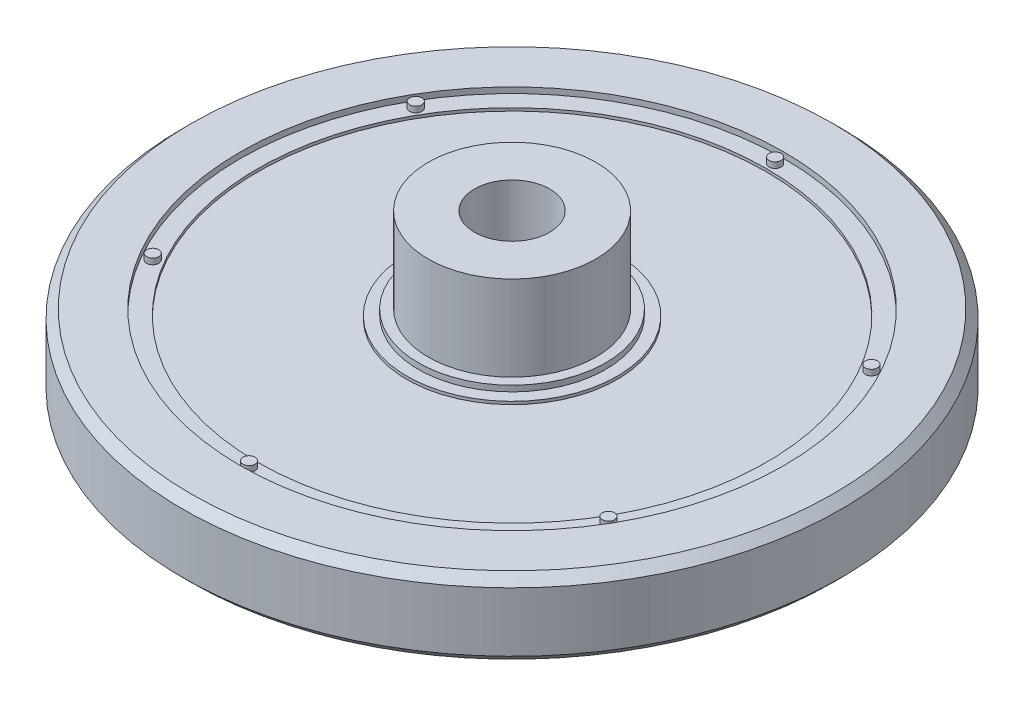
ISO-10303-21;
HEADER;
FILE_DESCRIPTION(('STEP AP214'),'2;1');
FILE_NAME('part.step','',(''),(''),'','','');
FILE_SCHEMA(('AUTOMOTIVE_DESIGN { 1 0 10303 214 1 1 1 1 }'));
ENDSEC;
DATA;
#1=APPLICATION_CONTEXT('core data for automotive mechanical design processes');
#2=APPLICATION_PROTOCOL_DEFINITION('international standard','automotive_design',2000,#1);
#3=PRODUCT_CONTEXT('',#1,'mechanical');
#4=PRODUCT('Part','Part','',(#3));
#5=PRODUCT_RELATED_PRODUCT_CATEGORY('part','',(#4));
#6=PRODUCT_DEFINITION_FORMATION('','',#4);
#7=PRODUCT_DEFINITION_CONTEXT('part definition',#1,'design');
#8=PRODUCT_DEFINITION('design','',#6,#7);
#9=PRODUCT_DEFINITION_SHAPE('','',#8);
#10=(LENGTH_UNIT() NAMED_UNIT(*) SI_UNIT(.MILLI.,.METRE.));
#11=(NAMED_UNIT(*) PLANE_ANGLE_UNIT() SI_UNIT($,.RADIAN.));
#12=(NAMED_UNIT(*) SI_UNIT($,.STERADIAN.) SOLID_ANGLE_UNIT());
#13=UNCERTAINTY_MEASURE_WITH_UNIT(LENGTH_MEASURE(1.E-05),#10,'distance_accuracy_value','');
#14=(GEOMETRIC_REPRESENTATION_CONTEXT(3) GLOBAL_UNCERTAINTY_ASSIGNED_CONTEXT((#13)) GLOBAL_UNIT_ASSIGNED_CONTEXT((#10,
#11,#12)) REPRESENTATION_CONTEXT('',''));
#15=CARTESIAN_POINT('',(0.,0.,0.));
#16=DIRECTION('',(0.,0.,1.));
#17=DIRECTION('',(1.,0.,0.));
#18=AXIS2_PLACEMENT_3D('',#15,#16,#17);
#19=CARTESIAN_POINT('',(-2.9,9.32,0.));
#20=DIRECTION('',(0.,-1.,0.));
#21=DIRECTION('',(0.,0.,-1.));
#22=AXIS2_PLACEMENT_3D('',#19,#20,#21);
#23=PLANE('',#22);
#24=CARTESIAN_POINT('',(0.,9.32,0.));
#25=DIRECTION('',(0.,-1.,0.));
#26=DIRECTION('',(0.,0.,-1.));
#27=AXIS2_PLACEMENT_3D('',#24,#25,#26);
#28=CIRCLE('',#27,2.9);
#29=CARTESIAN_POINT('',(0.,9.32,-2.9));
#30=VERTEX_POINT('',#29);
#31=EDGE_CURVE('E60',#30,#30,#28,.T.);
#32=ORIENTED_EDGE('',*,*,#31,.F.);
#33=EDGE_LOOP('',(#32));
#34=FACE_BOUND('',#33,.T.);
#35=CARTESIAN_POINT('',(0.,9.32,0.));
#36=DIRECTION('',(0.,-1.,0.));
#37=DIRECTION('',(0.,0.,-1.));
#38=AXIS2_PLACEMENT_3D('',#35,#36,#37);
#39=CIRCLE('',#38,1.3);
#40=CARTESIAN_POINT('',(0.,9.32,-1.3));
#41=VERTEX_POINT('',#40);
#42=EDGE_CURVE('E138',#41,#41,#39,.T.);
#43=ORIENTED_EDGE('',*,*,#42,.T.);
#44=EDGE_LOOP('',(#43));
#45=FACE_BOUND('',#44,.T.);
#46=ADVANCED_FACE('F35',(#34,#45),#23,.F.);
#47=CARTESIAN_POINT('',(0.,0.,0.));
#48=DIRECTION('',(0.,-1.,0.));
#49=DIRECTION('',(0.,0.,-1.));
#50=AXIS2_PLACEMENT_3D('',#47,#48,#49);
#51=CYLINDRICAL_SURFACE('',#50,2.9);
#52=CARTESIAN_POINT('',(0.,6.38,0.));
#53=DIRECTION('',(0.,-1.,0.));
#54=DIRECTION('',(0.,0.,-1.));
#55=AXIS2_PLACEMENT_3D('',#52,#53,#54);
#56=CIRCLE('',#55,2.9);
#57=CARTESIAN_POINT('',(0.,6.38,-2.9));
#58=VERTEX_POINT('',#57);
#59=EDGE_CURVE('E63',#58,#58,#56,.T.);
#60=ORIENTED_EDGE('',*,*,#59,.F.);
#61=EDGE_LOOP('',(#60));
#62=FACE_BOUND('',#61,.T.);
#63=ORIENTED_EDGE('',*,*,#31,.T.);
#64=EDGE_LOOP('',(#63));
#65=FACE_BOUND('',#64,.T.);
#66=ADVANCED_FACE('F175',(#62,#65),#51,.T.);
#67=CARTESIAN_POINT('',(-3.24,6.38,0.));
#68=DIRECTION('',(0.,-1.,0.));
#69=DIRECTION('',(0.,0.,-1.));
#70=AXIS2_PLACEMENT_3D('',#67,#68,#69);
#71=PLANE('',#70);
#72=CARTESIAN_POINT('',(0.,6.38,0.));
#73=DIRECTION('',(0.,-1.,0.));
#74=DIRECTION('',(0.,0.,-1.));
#75=AXIS2_PLACEMENT_3D('',#72,#73,#74);
#76=CIRCLE('',#75,3.24);
#77=CARTESIAN_POINT('',(0.,6.38,-3.24));
#78=VERTEX_POINT('',#77);
#79=EDGE_CURVE('E66',#78,#78,#76,.T.);
#80=ORIENTED_EDGE('',*,*,#79,.F.);
#81=EDGE_LOOP('',(#80));
#82=FACE_BOUND('',#81,.T.);
#83=ORIENTED_EDGE('',*,*,#59,.T.);
#84=EDGE_LOOP('',(#83));
#85=FACE_BOUND('',#84,.T.);
#86=ADVANCED_FACE('F180',(#82,#85),#71,.F.);
#87=CARTESIAN_POINT('',(0.,0.,0.));
#88=DIRECTION('',(0.,-1.,0.));
#89=DIRECTION('',(0.,0.,-1.));
#90=AXIS2_PLACEMENT_3D('',#87,#88,#89);
#91=CYLINDRICAL_SURFACE('',#90,3.24);
#92=CARTESIAN_POINT('',(0.,6.18,0.));
#93=DIRECTION('',(0.,-1.,0.));
#94=DIRECTION('',(0.,0.,-1.));
#95=AXIS2_PLACEMENT_3D('',#92,#93,#94);
#96=CIRCLE('',#95,3.24);
#97=CARTESIAN_POINT('',(0.,6.18,-3.24));
#98=VERTEX_POINT('',#97);
#99=EDGE_CURVE('E69',#98,#98,#96,.T.);
#100=ORIENTED_EDGE('',*,*,#99,.F.);
#101=EDGE_LOOP('',(#100));
#102=FACE_BOUND('',#101,.T.);
#103=ORIENTED_EDGE('',*,*,#79,.T.);
#104=EDGE_LOOP('',(#103));
#105=FACE_BOUND('',#104,.T.);
#106=ADVANCED_FACE('F323',(#102,#105),#91,.T.);
#107=CARTESIAN_POINT('',(-3.24,6.18,0.));
#108=DIRECTION('',(0.,-1.,0.));
#109=DIRECTION('',(0.,0.,-1.));
#110=AXIS2_PLACEMENT_3D('',#107,#108,#109);
#111=PLANE('',#110);
#112=CARTESIAN_POINT('',(0.,6.18,0.));
#113=DIRECTION('',(0.,-1.,0.));
#114=DIRECTION('',(0.,0.,-1.));
#115=AXIS2_PLACEMENT_3D('',#112,#113,#114);
#116=CIRCLE('',#115,3.64);
#117=CARTESIAN_POINT('',(0.,6.18,-3.64));
#118=VERTEX_POINT('',#117);
#119=EDGE_CURVE('E72',#118,#118,#116,.T.);
#120=ORIENTED_EDGE('',*,*,#119,.F.);
#121=EDGE_LOOP('',(#120));
#122=FACE_BOUND('',#121,.T.);
#123=ORIENTED_EDGE('',*,*,#99,.T.);
#124=EDGE_LOOP('',(#123));
#125=FACE_BOUND('',#124,.T.);
#126=ADVANCED_FACE('F317',(#122,#125),#111,.F.);
#127=CARTESIAN_POINT('',(0.,0.,0.));
#128=DIRECTION('',(0.,-1.,0.));
#129=DIRECTION('',(0.,0.,-1.));
#130=AXIS2_PLACEMENT_3D('',#127,#128,#129);
#131=CYLINDRICAL_SURFACE('',#130,3.64);
#132=CARTESIAN_POINT('',(0.,6.08,0.));
#133=DIRECTION('',(0.,-1.,0.));
#134=DIRECTION('',(0.,0.,-1.));
#135=AXIS2_PLACEMENT_3D('',#132,#133,#134);
#136=CIRCLE('',#135,3.64);
#137=CARTESIAN_POINT('',(0.,6.08,-3.64));
#138=VERTEX_POINT('',#137);
#139=EDGE_CURVE('E75',#138,#138,#136,.T.);
#140=ORIENTED_EDGE('',*,*,#139,.F.);
#141=EDGE_LOOP('',(#140));
#142=FACE_BOUND('',#141,.T.);
#143=ORIENTED_EDGE('',*,*,#119,.T.);
#144=EDGE_LOOP('',(#143));
#145=FACE_BOUND('',#144,.T.);
#146=ADVANCED_FACE('F311',(#142,#145),#131,.T.);
#147=CARTESIAN_POINT('',(-3.64,6.08,0.));
#148=DIRECTION('',(0.,-1.,0.));
#149=DIRECTION('',(0.,0.,-1.));
#150=AXIS2_PLACEMENT_3D('',#147,#148,#149);
#151=PLANE('',#150);
#152=CARTESIAN_POINT('',(0.,6.08,0.));
#153=DIRECTION('',(0.,-1.,0.));
#154=DIRECTION('',(0.,0.,-1.));
#155=AXIS2_PLACEMENT_3D('',#152,#153,#154);
#156=CIRCLE('',#155,8.8);
#157=CARTESIAN_POINT('',(0.,6.08,-8.8));
#158=VERTEX_POINT('',#157);
#159=EDGE_CURVE('E78',#158,#158,#156,.T.);
#160=ORIENTED_EDGE('',*,*,#159,.F.);
#161=EDGE_LOOP('',(#160));
#162=FACE_BOUND('',#161,.T.);
#163=ORIENTED_EDGE('',*,*,#139,.T.);
#164=EDGE_LOOP('',(#163));
#165=FACE_BOUND('',#164,.T.);
#166=ADVANCED_FACE('F305',(#162,#165),#151,.F.);
#167=CARTESIAN_POINT('',(0.,0.,0.));
#168=DIRECTION('',(0.,-1.,0.));
#169=DIRECTION('',(0.,0.,-1.));
#170=AXIS2_PLACEMENT_3D('',#167,#168,#169);
#171=CYLINDRICAL_SURFACE('',#170,8.8);
#172=CARTESIAN_POINT('',(0.,6.18,0.));
#173=DIRECTION('',(0.,-1.,0.));
#174=DIRECTION('',(0.,0.,-1.));
#175=AXIS2_PLACEMENT_3D('',#172,#173,#174);
#176=CIRCLE('',#175,8.8);
#177=CARTESIAN_POINT('',(0.,6.18,-8.8));
#178=VERTEX_POINT('',#177);
#179=EDGE_CURVE('E81',#178,#178,#176,.T.);
#180=ORIENTED_EDGE('',*,*,#179,.F.);
#181=EDGE_LOOP('',(#180));
#182=FACE_BOUND('',#181,.T.);
#183=ORIENTED_EDGE('',*,*,#159,.T.);
#184=EDGE_LOOP('',(#183));
#185=FACE_BOUND('',#184,.T.);
#186=ADVANCED_FACE('F298',(#182,#185),#171,.F.);
#187=CARTESIAN_POINT('',(-8.8,6.18,0.));
#188=DIRECTION('',(0.,-1.,0.));
#189=DIRECTION('',(0.,0.,-1.));
#190=AXIS2_PLACEMENT_3D('',#187,#188,#189);
#191=PLANE('',#190);
#192=CARTESIAN_POINT('',(-7.88083117443834,6.18,-4.55000000000009));
#193=DIRECTION('',(0.,-1.,0.));
#194=DIRECTION('',(0.,0.,-1.));
#195=AXIS2_PLACEMENT_3D('',#192,#193,#194);
#196=CIRCLE('',#195,0.21);
#197=CARTESIAN_POINT('',(-7.88083117443834,6.18,-4.76000000000009));
#198=VERTEX_POINT('',#197);
#199=EDGE_CURVE('E10',#198,#198,#196,.F.);
#200=ORIENTED_EDGE('',*,*,#199,.F.);
#201=EDGE_LOOP('',(#200));
#202=FACE_BOUND('',#201,.T.);
#203=CARTESIAN_POINT('',(-7.88083117443843,6.18,4.54999999999993));
#204=DIRECTION('',(0.,-1.,0.));
#205=DIRECTION('',(0.,0.,-1.));
#206=AXIS2_PLACEMENT_3D('',#203,#204,#205);
#207=CIRCLE('',#206,0.21);
#208=CARTESIAN_POINT('',(-7.88083117443843,6.18,4.33999999999993));
#209=VERTEX_POINT('',#208);
#210=EDGE_CURVE('E41',#209,#209,#207,.F.);
#211=ORIENTED_EDGE('',*,*,#210,.F.);
#212=EDGE_LOOP('',(#211));
#213=FACE_BOUND('',#212,.T.);
#214=CARTESIAN_POINT('',(0.,6.18,9.1));
#215=DIRECTION('',(0.,-1.,0.));
#216=DIRECTION('',(0.,0.,-1.));
#217=AXIS2_PLACEMENT_3D('',#214,#215,#216);
#218=CIRCLE('',#217,0.21);
#219=CARTESIAN_POINT('',(0.,6.18,8.89));
#220=VERTEX_POINT('',#219);
#221=EDGE_CURVE('E45',#220,#220,#218,.F.);
#222=ORIENTED_EDGE('',*,*,#221,.F.);
#223=EDGE_LOOP('',(#222));
#224=FACE_BOUND('',#223,.T.);
#225=CARTESIAN_POINT('',(7.88083117443837,6.18,4.55000000000004));
#226=DIRECTION('',(0.,-1.,0.));
#227=DIRECTION('',(0.,0.,-1.));
#228=AXIS2_PLACEMENT_3D('',#225,#226,#227);
#229=CIRCLE('',#228,0.21);
#230=CARTESIAN_POINT('',(7.88083117443837,6.18,4.34000000000004));
#231=VERTEX_POINT('',#230);
#232=EDGE_CURVE('E49',#231,#231,#229,.F.);
#233=ORIENTED_EDGE('',*,*,#232,.F.);
#234=EDGE_LOOP('',(#233));
#235=FACE_BOUND('',#234,.T.);
#236=CARTESIAN_POINT('',(7.8808311744384,6.18,-4.54999999999998));
#237=DIRECTION('',(0.,-1.,0.));
#238=DIRECTION('',(0.,0.,-1.));
#239=AXIS2_PLACEMENT_3D('',#236,#237,#238);
#240=CIRCLE('',#239,0.21);
#241=CARTESIAN_POINT('',(7.8808311744384,6.18,-4.75999999999998));
#242=VERTEX_POINT('',#241);
#243=EDGE_CURVE('E54',#242,#242,#240,.F.);
#244=ORIENTED_EDGE('',*,*,#243,.F.);
#245=EDGE_LOOP('',(#244));
#246=FACE_BOUND('',#245,.T.);
#247=CARTESIAN_POINT('',(0.,6.18,-9.1));
#248=DIRECTION('',(0.,-1.,0.));
#249=DIRECTION('',(0.,0.,-1.));
#250=AXIS2_PLACEMENT_3D('',#247,#248,#249);
#251=CIRCLE('',#250,0.21);
#252=CARTESIAN_POINT('',(0.,6.18,-9.31));
#253=VERTEX_POINT('',#252);
#254=EDGE_CURVE('E57',#253,#253,#251,.F.);
#255=ORIENTED_EDGE('',*,*,#254,.F.);
#256=EDGE_LOOP('',(#255));
#257=FACE_BOUND('',#256,.T.);
#258=CARTESIAN_POINT('',(0.,6.18,0.));
#259=DIRECTION('',(0.,-1.,0.));
#260=DIRECTION('',(0.,0.,-1.));
#261=AXIS2_PLACEMENT_3D('',#258,#259,#260);
#262=CIRCLE('',#261,9.4);
#263=CARTESIAN_POINT('',(0.,6.18,-9.4));
#264=VERTEX_POINT('',#263);
#265=EDGE_CURVE('E84',#264,#264,#262,.T.);
#266=ORIENTED_EDGE('',*,*,#265,.F.);
#267=EDGE_LOOP('',(#266));
#268=FACE_BOUND('',#267,.T.);
#269=ORIENTED_EDGE('',*,*,#179,.T.);
#270=EDGE_LOOP('',(#269));
#271=FACE_BOUND('',#270,.T.);
#272=ADVANCED_FACE('F292',(#202,#213,#224,#235,#246,#257,#268,#271),#191,.F.);
#273=CARTESIAN_POINT('',(0.,0.,0.));
#274=DIRECTION('',(0.,-1.,0.));
#275=DIRECTION('',(0.,0.,-1.));
#276=AXIS2_PLACEMENT_3D('',#273,#274,#275);
#277=CYLINDRICAL_SURFACE('',#276,9.4);
#278=CARTESIAN_POINT('',(0.,6.38,0.));
#279=DIRECTION('',(0.,-1.,0.));
#280=DIRECTION('',(0.,0.,-1.));
#281=AXIS2_PLACEMENT_3D('',#278,#279,#280);
#282=CIRCLE('',#281,9.4);
#283=CARTESIAN_POINT('',(0.,6.38,-9.4));
#284=VERTEX_POINT('',#283);
#285=EDGE_CURVE('E87',#284,#284,#282,.T.);
#286=ORIENTED_EDGE('',*,*,#285,.F.);
#287=EDGE_LOOP('',(#286));
#288=FACE_BOUND('',#287,.T.);
#289=ORIENTED_EDGE('',*,*,#265,.T.);
#290=EDGE_LOOP('',(#289));
#291=FACE_BOUND('',#290,.T.);
#292=ADVANCED_FACE('F286',(#288,#291),#277,.F.);
#293=CARTESIAN_POINT('',(-9.4,6.38,0.));
#294=DIRECTION('',(0.,-1.,0.));
#295=DIRECTION('',(0.,0.,-1.));
#296=AXIS2_PLACEMENT_3D('',#293,#294,#295);
#297=PLANE('',#296);
#298=CARTESIAN_POINT('',(0.,6.38,0.));
#299=DIRECTION('',(0.,-1.,0.));
#300=DIRECTION('',(0.,0.,-1.));
#301=AXIS2_PLACEMENT_3D('',#298,#299,#300);
#302=CIRCLE('',#301,11.1);
#303=CARTESIAN_POINT('',(0.,6.38,-11.1));
#304=VERTEX_POINT('',#303);
#305=EDGE_CURVE('E90',#304,#304,#302,.T.);
#306=ORIENTED_EDGE('',*,*,#305,.F.);
#307=EDGE_LOOP('',(#306));
#308=FACE_BOUND('',#307,.T.);
#309=ORIENTED_EDGE('',*,*,#285,.T.);
#310=EDGE_LOOP('',(#309));
#311=FACE_BOUND('',#310,.T.);
#312=ADVANCED_FACE('F280',(#308,#311),#297,.F.);
#313=CARTESIAN_POINT('',(0.,6.38,0.));
#314=DIRECTION('',(0.,-1.,0.));
#315=DIRECTION('',(0.,0.,-1.));
#316=AXIS2_PLACEMENT_3D('',#313,#314,#315);
#317=CONICAL_SURFACE('',#316,11.1,0.785398163397443);
#318=CARTESIAN_POINT('',(0.,6.08,0.));
#319=DIRECTION('',(0.,-1.,0.));
#320=DIRECTION('',(0.,0.,-1.));
#321=AXIS2_PLACEMENT_3D('',#318,#319,#320);
#322=CIRCLE('',#321,11.4);
#323=CARTESIAN_POINT('',(0.,6.08,-11.4));
#324=VERTEX_POINT('',#323);
#325=EDGE_CURVE('E93',#324,#324,#322,.T.);
#326=ORIENTED_EDGE('',*,*,#325,.F.);
#327=EDGE_LOOP('',(#326));
#328=FACE_BOUND('',#327,.T.);
#329=ORIENTED_EDGE('',*,*,#305,.T.);
#330=EDGE_LOOP('',(#329));
#331=FACE_BOUND('',#330,.T.);
#332=ADVANCED_FACE('F274',(#328,#331),#317,.T.);
#333=CARTESIAN_POINT('',(0.,0.,0.));
#334=DIRECTION('',(0.,-1.,0.));
#335=DIRECTION('',(0.,0.,-1.));
#336=AXIS2_PLACEMENT_3D('',#333,#334,#335);
#337=CYLINDRICAL_SURFACE('',#336,11.4);
#338=CARTESIAN_POINT('',(0.,4.03,0.));
#339=DIRECTION('',(0.,-1.,0.));
#340=DIRECTION('',(0.,0.,-1.));
#341=AXIS2_PLACEMENT_3D('',#338,#339,#340);
#342=CIRCLE('',#341,11.4);
#343=CARTESIAN_POINT('',(0.,4.03,-11.4));
#344=VERTEX_POINT('',#343);
#345=EDGE_CURVE('E96',#344,#344,#342,.T.);
#346=ORIENTED_EDGE('',*,*,#345,.F.);
#347=EDGE_LOOP('',(#346));
#348=FACE_BOUND('',#347,.T.);
#349=ORIENTED_EDGE('',*,*,#325,.T.);
#350=EDGE_LOOP('',(#349));
#351=FACE_BOUND('',#350,.T.);
#352=ADVANCED_FACE('F268',(#348,#351),#337,.T.);
#353=CARTESIAN_POINT('',(0.,4.03,0.));
#354=DIRECTION('',(0.,1.,0.));
#355=DIRECTION('',(0.,0.,1.));
#356=AXIS2_PLACEMENT_3D('',#353,#354,#355);
#357=CONICAL_SURFACE('',#356,11.4,0.785398163397445);
#358=CARTESIAN_POINT('',(0.,3.73,0.));
#359=DIRECTION('',(0.,-1.,0.));
#360=DIRECTION('',(0.,0.,-1.));
#361=AXIS2_PLACEMENT_3D('',#358,#359,#360);
#362=CIRCLE('',#361,11.1);
#363=CARTESIAN_POINT('',(0.,3.73,-11.1));
#364=VERTEX_POINT('',#363);
#365=EDGE_CURVE('E99',#364,#364,#362,.T.);
#366=ORIENTED_EDGE('',*,*,#365,.F.);
#367=EDGE_LOOP('',(#366));
#368=FACE_BOUND('',#367,.T.);
#369=ORIENTED_EDGE('',*,*,#345,.T.);
#370=EDGE_LOOP('',(#369));
#371=FACE_BOUND('',#370,.T.);
#372=ADVANCED_FACE('F262',(#368,#371),#357,.T.);
#373=CARTESIAN_POINT('',(-11.1,3.73,0.));
#374=DIRECTION('',(0.,1.,0.));
#375=DIRECTION('',(0.,0.,1.));
#376=AXIS2_PLACEMENT_3D('',#373,#374,#375);
#377=PLANE('',#376);
#378=CARTESIAN_POINT('',(0.,3.73,0.));
#379=DIRECTION('',(0.,-1.,0.));
#380=DIRECTION('',(0.,0.,-1.));
#381=AXIS2_PLACEMENT_3D('',#378,#379,#380);
#382=CIRCLE('',#381,9.4);
#383=CARTESIAN_POINT('',(0.,3.73,-9.4));
#384=VERTEX_POINT('',#383);
#385=EDGE_CURVE('E102',#384,#384,#382,.T.);
#386=ORIENTED_EDGE('',*,*,#385,.F.);
#387=EDGE_LOOP('',(#386));
#388=FACE_BOUND('',#387,.T.);
#389=ORIENTED_EDGE('',*,*,#365,.T.);
#390=EDGE_LOOP('',(#389));
#391=FACE_BOUND('',#390,.T.);
#392=ADVANCED_FACE('F256',(#388,#391),#377,.F.);
#393=CARTESIAN_POINT('',(0.,3.73,0.));
#394=DIRECTION('',(0.,-1.,0.));
#395=DIRECTION('',(0.,0.,-1.));
#396=AXIS2_PLACEMENT_3D('',#393,#394,#395);
#397=CONICAL_SURFACE('',#396,9.4,1.48210830505474);
#398=CARTESIAN_POINT('',(0.,4.34,0.));
#399=DIRECTION('',(0.,-1.,0.));
#400=DIRECTION('',(0.,0.,-1.));
#401=AXIS2_PLACEMENT_3D('',#398,#399,#400);
#402=CIRCLE('',#401,2.54);
#403=CARTESIAN_POINT('',(0.,4.34,-2.53999999999999));
#404=VERTEX_POINT('',#403);
#405=EDGE_CURVE('E105',#404,#404,#402,.T.);
#406=CARTESIAN_POINT('',(0.,4.34,-2.53999999999999));
#407=CARTESIAN_POINT('',(0.,4.33364583333333,-2.61145833333333));
#408=CARTESIAN_POINT('',(0.,4.32729166666667,-2.68291666666666));
#409=CARTESIAN_POINT('',(0.,4.31458333333333,-2.82583333333333));
#410=CARTESIAN_POINT('',(0.,4.30822916666667,-2.89729166666666));
#411=CARTESIAN_POINT('',(0.,4.29552083333333,-3.04020833333333));
#412=CARTESIAN_POINT('',(0.,4.28916666666667,-3.11166666666666));
#413=CARTESIAN_POINT('',(0.,4.27645833333333,-3.25458333333333));
#414=CARTESIAN_POINT('',(0.,4.27010416666667,-3.32604166666666));
#415=CARTESIAN_POINT('',(0.,4.25739583333333,-3.46895833333333));
#416=CARTESIAN_POINT('',(0.,4.25104166666667,-3.54041666666666));
#417=CARTESIAN_POINT('',(0.,4.23833333333333,-3.68333333333333));
#418=CARTESIAN_POINT('',(0.,4.23197916666667,-3.75479166666666));
#419=CARTESIAN_POINT('',(0.,4.21927083333333,-3.89770833333333));
#420=CARTESIAN_POINT('',(0.,4.21291666666667,-3.96916666666666));
#421=CARTESIAN_POINT('',(0.,4.20020833333333,-4.11208333333333));
#422=CARTESIAN_POINT('',(0.,4.19385416666667,-4.18354166666666));
#423=CARTESIAN_POINT('',(0.,4.18114583333333,-4.32645833333333));
#424=CARTESIAN_POINT('',(0.,4.17479166666667,-4.39791666666666));
#425=CARTESIAN_POINT('',(0.,4.16208333333333,-4.54083333333333));
#426=CARTESIAN_POINT('',(0.,4.15572916666667,-4.61229166666666));
#427=CARTESIAN_POINT('',(0.,4.14302083333333,-4.75520833333333));
#428=CARTESIAN_POINT('',(0.,4.13666666666667,-4.82666666666666));
#429=CARTESIAN_POINT('',(0.,4.12395833333333,-4.96958333333333));
#430=CARTESIAN_POINT('',(0.,4.11760416666667,-5.04104166666666));
#431=CARTESIAN_POINT('',(0.,4.10489583333333,-5.18395833333333));
#432=CARTESIAN_POINT('',(0.,4.09854166666667,-5.25541666666666));
#433=CARTESIAN_POINT('',(0.,4.08583333333333,-5.39833333333333));
#434=CARTESIAN_POINT('',(0.,4.07947916666667,-5.46979166666666));
#435=CARTESIAN_POINT('',(0.,4.06677083333333,-5.61270833333333));
#436=CARTESIAN_POINT('',(0.,4.06041666666667,-5.68416666666666));
#437=CARTESIAN_POINT('',(0.,4.04770833333333,-5.82708333333333));
#438=CARTESIAN_POINT('',(0.,4.04135416666667,-5.89854166666666));
#439=CARTESIAN_POINT('',(0.,4.02864583333333,-6.04145833333333));
#440=CARTESIAN_POINT('',(0.,4.02229166666667,-6.11291666666666));
#441=CARTESIAN_POINT('',(0.,4.00958333333333,-6.25583333333333));
#442=CARTESIAN_POINT('',(0.,4.00322916666667,-6.32729166666666));
#443=CARTESIAN_POINT('',(0.,3.99052083333333,-6.47020833333333));
#444=CARTESIAN_POINT('',(0.,3.98416666666667,-6.54166666666666));
#445=CARTESIAN_POINT('',(0.,3.97145833333333,-6.68458333333333));
#446=CARTESIAN_POINT('',(0.,3.96510416666667,-6.75604166666666));
#447=CARTESIAN_POINT('',(0.,3.95239583333333,-6.89895833333333));
#448=CARTESIAN_POINT('',(0.,3.94604166666667,-6.97041666666666));
#449=CARTESIAN_POINT('',(0.,3.93333333333333,-7.11333333333333));
#450=CARTESIAN_POINT('',(0.,3.92697916666667,-7.18479166666666));
#451=CARTESIAN_POINT('',(0.,3.91427083333333,-7.32770833333333));
#452=CARTESIAN_POINT('',(0.,3.90791666666667,-7.39916666666666));
#453=CARTESIAN_POINT('',(0.,3.89520833333333,-7.54208333333333));
#454=CARTESIAN_POINT('',(0.,3.88885416666667,-7.61354166666666));
#455=CARTESIAN_POINT('',(0.,3.87614583333333,-7.75645833333333));
#456=CARTESIAN_POINT('',(0.,3.86979166666667,-7.82791666666666));
#457=CARTESIAN_POINT('',(0.,3.85708333333333,-7.97083333333333));
#458=CARTESIAN_POINT('',(0.,3.85072916666667,-8.04229166666666));
#459=CARTESIAN_POINT('',(0.,3.83802083333333,-8.18520833333333));
#460=CARTESIAN_POINT('',(0.,3.83166666666667,-8.25666666666666));
#461=CARTESIAN_POINT('',(0.,3.81895833333333,-8.39958333333333));
#462=CARTESIAN_POINT('',(0.,3.81260416666667,-8.47104166666666));
#463=CARTESIAN_POINT('',(0.,3.79989583333333,-8.61395833333333));
#464=CARTESIAN_POINT('',(0.,3.79354166666667,-8.68541666666667));
#465=CARTESIAN_POINT('',(0.,3.78083333333333,-8.82833333333333));
#466=CARTESIAN_POINT('',(0.,3.77447916666667,-8.89979166666666));
#467=CARTESIAN_POINT('',(0.,3.76177083333333,-9.04270833333333));
#468=CARTESIAN_POINT('',(0.,3.75541666666667,-9.11416666666666));
#469=CARTESIAN_POINT('',(0.,3.74270833333333,-9.25708333333333));
#470=CARTESIAN_POINT('',(0.,3.73635416666667,-9.32854166666667));
#471=CARTESIAN_POINT('',(0.,3.73,-9.4));
#472=B_SPLINE_CURVE_WITH_KNOTS('',3,(#406,#407,#408,#409,#410,#411,#412,#413,#414,#415,#416,
#417,#418,#419,#420,#421,#422,#423,#424,#425,#426,#427,#428,#429,#430,#431,#432,#433,#434,#435,
#436,#437,#438,#439,#440,#441,#442,#443,#444,#445,#446,#447,#448,#449,#450,#451,#452,#453,#454,
#455,#456,#457,#458,#459,#460,#461,#462,#463,#464,#465,#466,#467,#468,#469,#470,#471),
.UNSPECIFIED.,.F.,.F.,(4,2,2,2,2,2,2,2,2,2,2,2,2,2,2,2,2,2,2,2,2,2,2,2,2,2,2,2,2,2,2,2,4),(0.,
0.215220862211937,0.430441724423877,0.645662586635814,0.860883448847753,1.07610431105969,
1.29132517327163,1.50654603548357,1.7217668976955,1.93698775990744,2.15220862211938,
2.36742948433132,2.58265034654326,2.7978712087552,3.01309207096713,3.22831293317907,
3.44353379539101,3.65875465760295,3.87397551981489,4.08919638202682,4.30441724423876,
4.5196381064507,4.73485896866264,4.95007983087458,5.16530069308652,5.38052155529846,
5.59574241751039,5.81096327972233,6.02618414193427,6.24140500414621,6.45662586635815,
6.67184672857009,6.88706759078203),.UNSPECIFIED.);
#473=EDGE_CURVE('BSEAM250',#404,#384,#472,.T.);
#474=ORIENTED_EDGE('',*,*,#405,.F.);
#475=ORIENTED_EDGE('',*,*,#385,.T.);
#476=ORIENTED_EDGE('',*,*,#473,.T.);
#477=ORIENTED_EDGE('',*,*,#473,.F.);
#478=EDGE_LOOP('',(#474,#476,#475,#477));
#479=FACE_BOUND('',#478,.T.);
#480=ADVANCED_FACE('F250',(#479),#397,.F.);
#481=CARTESIAN_POINT('',(0.,0.,0.));
#482=DIRECTION('',(0.,-1.,0.));
#483=DIRECTION('',(0.,0.,-1.));
#484=AXIS2_PLACEMENT_3D('',#481,#482,#483);
#485=CYLINDRICAL_SURFACE('',#484,2.54);
#486=CARTESIAN_POINT('',(0.,4.28914672561031,0.));
#487=DIRECTION('',(0.,-1.,0.));
#488=DIRECTION('',(0.,0.,-1.));
#489=AXIS2_PLACEMENT_3D('',#486,#487,#488);
#490=CIRCLE('',#489,2.54);
#491=CARTESIAN_POINT('',(0.,4.28914672561031,-2.54));
#492=VERTEX_POINT('',#491);
#493=EDGE_CURVE('E108',#492,#492,#490,.T.);
#494=ORIENTED_EDGE('',*,*,#493,.F.);
#495=EDGE_LOOP('',(#494));
#496=FACE_BOUND('',#495,.T.);
#497=ORIENTED_EDGE('',*,*,#405,.T.);
#498=EDGE_LOOP('',(#497));
#499=FACE_BOUND('',#498,.T.);
#500=ADVANCED_FACE('F244',(#496,#499),#485,.T.);
#501=CARTESIAN_POINT('',(-2.61,4.28914672561031,0.));
#502=DIRECTION('',(0.,-1.,0.));
#503=DIRECTION('',(0.,0.,-1.));
#504=AXIS2_PLACEMENT_3D('',#501,#502,#503);
#505=PLANE('',#504);
#506=CARTESIAN_POINT('',(0.,4.28914672561031,0.));
#507=DIRECTION('',(0.,-1.,0.));
#508=DIRECTION('',(0.,0.,-1.));
#509=AXIS2_PLACEMENT_3D('',#506,#507,#508);
#510=CIRCLE('',#509,2.61);
#511=CARTESIAN_POINT('',(0.,4.28914672561031,-2.61));
#512=VERTEX_POINT('',#511);
#513=EDGE_CURVE('E111',#512,#512,#510,.T.);
#514=ORIENTED_EDGE('',*,*,#513,.F.);
#515=EDGE_LOOP('',(#514));
#516=FACE_BOUND('',#515,.T.);
#517=ORIENTED_EDGE('',*,*,#493,.T.);
#518=EDGE_LOOP('',(#517));
#519=FACE_BOUND('',#518,.T.);
#520=ADVANCED_FACE('F238',(#516,#519),#505,.F.);
#521=CARTESIAN_POINT('',(0.,0.,0.));
#522=DIRECTION('',(0.,-1.,0.));
#523=DIRECTION('',(0.,0.,-1.));
#524=AXIS2_PLACEMENT_3D('',#521,#522,#523);
#525=CYLINDRICAL_SURFACE('',#524,2.61);
#526=CARTESIAN_POINT('',(0.,4.03,0.));
#527=DIRECTION('',(0.,-1.,0.));
#528=DIRECTION('',(0.,0.,-1.));
#529=AXIS2_PLACEMENT_3D('',#526,#527,#528);
#530=CIRCLE('',#529,2.61);
#531=CARTESIAN_POINT('',(0.,4.03,-2.61));
#532=VERTEX_POINT('',#531);
#533=EDGE_CURVE('E114',#532,#532,#530,.T.);
#534=ORIENTED_EDGE('',*,*,#533,.F.);
#535=EDGE_LOOP('',(#534));
#536=FACE_BOUND('',#535,.T.);
#537=ORIENTED_EDGE('',*,*,#513,.T.);
#538=EDGE_LOOP('',(#537));
#539=FACE_BOUND('',#538,.T.);
#540=ADVANCED_FACE('F232',(#536,#539),#525,.T.);
#541=CARTESIAN_POINT('',(-2.5,4.03,0.));
#542=DIRECTION('',(0.,1.,0.));
#543=DIRECTION('',(0.,0.,1.));
#544=AXIS2_PLACEMENT_3D('',#541,#542,#543);
#545=PLANE('',#544);
#546=CARTESIAN_POINT('',(0.,4.03,0.));
#547=DIRECTION('',(0.,-1.,0.));
#548=DIRECTION('',(0.,0.,-1.));
#549=AXIS2_PLACEMENT_3D('',#546,#547,#548);
#550=CIRCLE('',#549,2.5);
#551=CARTESIAN_POINT('',(0.,4.03,-2.5));
#552=VERTEX_POINT('',#551);
#553=EDGE_CURVE('E117',#552,#552,#550,.T.);
#554=ORIENTED_EDGE('',*,*,#553,.F.);
#555=EDGE_LOOP('',(#554));
#556=FACE_BOUND('',#555,.T.);
#557=ORIENTED_EDGE('',*,*,#533,.T.);
#558=EDGE_LOOP('',(#557));
#559=FACE_BOUND('',#558,.T.);
#560=ADVANCED_FACE('F226',(#556,#559),#545,.F.);
#561=CARTESIAN_POINT('',(0.,0.,0.));
#562=DIRECTION('',(0.,-1.,0.));
#563=DIRECTION('',(0.,0.,-1.));
#564=AXIS2_PLACEMENT_3D('',#561,#562,#563);
#565=CYLINDRICAL_SURFACE('',#564,2.5);
#566=CARTESIAN_POINT('',(0.,2.68,0.));
#567=DIRECTION('',(0.,-1.,0.));
#568=DIRECTION('',(0.,0.,-1.));
#569=AXIS2_PLACEMENT_3D('',#566,#567,#568);
#570=CIRCLE('',#569,2.5);
#571=CARTESIAN_POINT('',(0.,2.68,-2.5));
#572=VERTEX_POINT('',#571);
#573=EDGE_CURVE('E120',#572,#572,#570,.T.);
#574=ORIENTED_EDGE('',*,*,#573,.F.);
#575=EDGE_LOOP('',(#574));
#576=FACE_BOUND('',#575,.T.);
#577=ORIENTED_EDGE('',*,*,#553,.T.);
#578=EDGE_LOOP('',(#577));
#579=FACE_BOUND('',#578,.T.);
#580=ADVANCED_FACE('F220',(#576,#579),#565,.T.);
#581=CARTESIAN_POINT('',(-2.5,2.68,0.));
#582=DIRECTION('',(0.,1.,0.));
#583=DIRECTION('',(0.,0.,1.));
#584=AXIS2_PLACEMENT_3D('',#581,#582,#583);
#585=PLANE('',#584);
#586=CARTESIAN_POINT('',(0.,2.68,0.));
#587=DIRECTION('',(0.,-1.,0.));
#588=DIRECTION('',(0.,0.,-1.));
#589=AXIS2_PLACEMENT_3D('',#586,#587,#588);
#590=CIRCLE('',#589,1.81);
#591=CARTESIAN_POINT('',(0.,2.68,-1.81));
#592=VERTEX_POINT('',#591);
#593=EDGE_CURVE('E123',#592,#592,#590,.T.);
#594=ORIENTED_EDGE('',*,*,#593,.F.);
#595=EDGE_LOOP('',(#594));
#596=FACE_BOUND('',#595,.T.);
#597=ORIENTED_EDGE('',*,*,#573,.T.);
#598=EDGE_LOOP('',(#597));
#599=FACE_BOUND('',#598,.T.);
#600=ADVANCED_FACE('F214',(#596,#599),#585,.F.);
#601=CARTESIAN_POINT('',(0.,0.,0.));
#602=DIRECTION('',(0.,-1.,0.));
#603=DIRECTION('',(0.,0.,-1.));
#604=AXIS2_PLACEMENT_3D('',#601,#602,#603);
#605=CYLINDRICAL_SURFACE('',#604,1.81);
#606=CARTESIAN_POINT('',(0.,4.68,0.));
#607=DIRECTION('',(0.,-1.,0.));
#608=DIRECTION('',(0.,0.,-1.));
#609=AXIS2_PLACEMENT_3D('',#606,#607,#608);
#610=CIRCLE('',#609,1.81);
#611=CARTESIAN_POINT('',(0.,4.68,-1.81));
#612=VERTEX_POINT('',#611);
#613=EDGE_CURVE('E126',#612,#612,#610,.T.);
#614=ORIENTED_EDGE('',*,*,#613,.F.);
#615=EDGE_LOOP('',(#614));
#616=FACE_BOUND('',#615,.T.);
#617=ORIENTED_EDGE('',*,*,#593,.T.);
#618=EDGE_LOOP('',(#617));
#619=FACE_BOUND('',#618,.T.);
#620=ADVANCED_FACE('F208',(#616,#619),#605,.F.);
#621=CARTESIAN_POINT('',(-1.81,4.68,0.));
#622=DIRECTION('',(0.,1.,0.));
#623=DIRECTION('',(0.,0.,1.));
#624=AXIS2_PLACEMENT_3D('',#621,#622,#623);
#625=PLANE('',#624);
#626=CARTESIAN_POINT('',(0.,4.68,0.));
#627=DIRECTION('',(0.,-1.,0.));
#628=DIRECTION('',(0.,0.,-1.));
#629=AXIS2_PLACEMENT_3D('',#626,#627,#628);
#630=CIRCLE('',#629,1.56);
#631=CARTESIAN_POINT('',(0.,4.68,-1.56));
#632=VERTEX_POINT('',#631);
#633=EDGE_CURVE('E129',#632,#632,#630,.T.);
#634=ORIENTED_EDGE('',*,*,#633,.F.);
#635=EDGE_LOOP('',(#634));
#636=FACE_BOUND('',#635,.T.);
#637=ORIENTED_EDGE('',*,*,#613,.T.);
#638=EDGE_LOOP('',(#637));
#639=FACE_BOUND('',#638,.T.);
#640=ADVANCED_FACE('F202',(#636,#639),#625,.F.);
#641=CARTESIAN_POINT('',(0.,0.,0.));
#642=DIRECTION('',(0.,-1.,0.));
#643=DIRECTION('',(0.,0.,-1.));
#644=AXIS2_PLACEMENT_3D('',#641,#642,#643);
#645=CYLINDRICAL_SURFACE('',#644,1.56);
#646=CARTESIAN_POINT('',(0.,6.78,0.));
#647=DIRECTION('',(0.,-1.,0.));
#648=DIRECTION('',(0.,0.,-1.));
#649=AXIS2_PLACEMENT_3D('',#646,#647,#648);
#650=CIRCLE('',#649,1.56);
#651=CARTESIAN_POINT('',(0.,6.78,-1.56));
#652=VERTEX_POINT('',#651);
#653=EDGE_CURVE('E132',#652,#652,#650,.T.);
#654=ORIENTED_EDGE('',*,*,#653,.F.);
#655=EDGE_LOOP('',(#654));
#656=FACE_BOUND('',#655,.T.);
#657=ORIENTED_EDGE('',*,*,#633,.T.);
#658=EDGE_LOOP('',(#657));
#659=FACE_BOUND('',#658,.T.);
#660=ADVANCED_FACE('F196',(#656,#659),#645,.F.);
#661=CARTESIAN_POINT('',(-1.56,6.78,0.));
#662=DIRECTION('',(0.,1.,0.));
#663=DIRECTION('',(0.,0.,1.));
#664=AXIS2_PLACEMENT_3D('',#661,#662,#663);
#665=PLANE('',#664);
#666=CARTESIAN_POINT('',(0.,6.78,0.));
#667=DIRECTION('',(0.,-1.,0.));
#668=DIRECTION('',(0.,0.,-1.));
#669=AXIS2_PLACEMENT_3D('',#666,#667,#668);
#670=CIRCLE('',#669,1.3);
#671=CARTESIAN_POINT('',(0.,6.78,-1.3));
#672=VERTEX_POINT('',#671);
#673=EDGE_CURVE('E135',#672,#672,#670,.T.);
#674=ORIENTED_EDGE('',*,*,#673,.F.);
#675=EDGE_LOOP('',(#674));
#676=FACE_BOUND('',#675,.T.);
#677=ORIENTED_EDGE('',*,*,#653,.T.);
#678=EDGE_LOOP('',(#677));
#679=FACE_BOUND('',#678,.T.);
#680=ADVANCED_FACE('F190',(#676,#679),#665,.F.);
#681=CARTESIAN_POINT('',(0.,0.,0.));
#682=DIRECTION('',(0.,-1.,0.));
#683=DIRECTION('',(0.,0.,-1.));
#684=AXIS2_PLACEMENT_3D('',#681,#682,#683);
#685=CYLINDRICAL_SURFACE('',#684,1.3);
#686=ORIENTED_EDGE('',*,*,#42,.F.);
#687=EDGE_LOOP('',(#686));
#688=FACE_BOUND('',#687,.T.);
#689=ORIENTED_EDGE('',*,*,#673,.T.);
#690=EDGE_LOOP('',(#689));
#691=FACE_BOUND('',#690,.T.);
#692=ADVANCED_FACE('F186',(#688,#691),#685,.F.);
#693=CARTESIAN_POINT('',(0.,6.38,-9.1));
#694=DIRECTION('',(0.,-1.,0.));
#695=DIRECTION('',(0.,0.,-1.));
#696=AXIS2_PLACEMENT_3D('',#693,#694,#695);
#697=CYLINDRICAL_SURFACE('',#696,0.21);
#698=CARTESIAN_POINT('',(0.,6.38,-9.1));
#699=DIRECTION('',(0.,1.,0.));
#700=DIRECTION('',(0.,0.,1.));
#701=AXIS2_PLACEMENT_3D('',#698,#699,#700);
#702=CIRCLE('',#701,0.21);
#703=CARTESIAN_POINT('',(0.,6.38,-8.89));
#704=VERTEX_POINT('',#703);
#705=EDGE_CURVE('E141',#704,#704,#702,.T.);
#706=ORIENTED_EDGE('',*,*,#705,.F.);
#707=EDGE_LOOP('',(#706));
#708=FACE_BOUND('',#707,.T.);
#709=ORIENTED_EDGE('',*,*,#254,.T.);
#710=EDGE_LOOP('',(#709));
#711=FACE_BOUND('',#710,.T.);
#712=ADVANCED_FACE('F189',(#708,#711),#697,.T.);
#713=CARTESIAN_POINT('',(0.,6.38,-9.1));
#714=DIRECTION('',(0.,1.,0.));
#715=DIRECTION('',(0.,0.,1.));
#716=AXIS2_PLACEMENT_3D('',#713,#714,#715);
#717=PLANE('',#716);
#718=ORIENTED_EDGE('',*,*,#705,.T.);
#719=EDGE_LOOP('',(#718));
#720=FACE_BOUND('',#719,.T.);
#721=ADVANCED_FACE('F342',(#720),#717,.T.);
#722=CARTESIAN_POINT('',(7.8808311744384,6.38,-4.54999999999998));
#723=DIRECTION('',(0.,-1.,0.));
#724=DIRECTION('',(0.,0.,-1.));
#725=AXIS2_PLACEMENT_3D('',#722,#723,#724);
#726=CYLINDRICAL_SURFACE('',#725,0.21);
#727=CARTESIAN_POINT('',(7.8808311744384,6.38,-4.54999999999998));
#728=DIRECTION('',(0.,1.,0.));
#729=DIRECTION('',(-0.86602540378444,0.,0.499999999999998));
#730=AXIS2_PLACEMENT_3D('',#727,#728,#729);
#731=CIRCLE('',#730,0.21);
#732=CARTESIAN_POINT('',(7.69896583964367,6.38,-4.44499999999998));
#733=VERTEX_POINT('',#732);
#734=EDGE_CURVE('E144',#733,#733,#731,.T.);
#735=ORIENTED_EDGE('',*,*,#734,.F.);
#736=EDGE_LOOP('',(#735));
#737=FACE_BOUND('',#736,.T.);
#738=ORIENTED_EDGE('',*,*,#243,.T.);
#739=EDGE_LOOP('',(#738));
#740=FACE_BOUND('',#739,.T.);
#741=ADVANCED_FACE('F346',(#737,#740),#726,.T.);
#742=CARTESIAN_POINT('',(7.8808311744384,6.38,-4.54999999999998));
#743=DIRECTION('',(0.,1.,0.));
#744=DIRECTION('',(-0.86602540378444,0.,0.499999999999998));
#745=AXIS2_PLACEMENT_3D('',#742,#743,#744);
#746=PLANE('',#745);
#747=ORIENTED_EDGE('',*,*,#734,.T.);
#748=EDGE_LOOP('',(#747));
#749=FACE_BOUND('',#748,.T.);
#750=ADVANCED_FACE('F350',(#749),#746,.T.);
#751=CARTESIAN_POINT('',(7.88083117443837,6.38,4.55000000000004));
#752=DIRECTION('',(0.,-1.,0.));
#753=DIRECTION('',(0.,0.,-1.));
#754=AXIS2_PLACEMENT_3D('',#751,#752,#753);
#755=CYLINDRICAL_SURFACE('',#754,0.21);
#756=CARTESIAN_POINT('',(7.88083117443837,6.38,4.55000000000004));
#757=DIRECTION('',(0.,1.,0.));
#758=DIRECTION('',(-0.866025403784436,0.,-0.500000000000004));
#759=AXIS2_PLACEMENT_3D('',#756,#757,#758);
#760=CIRCLE('',#759,0.21);
#761=CARTESIAN_POINT('',(7.69896583964364,6.38,4.44500000000004));
#762=VERTEX_POINT('',#761);
#763=EDGE_CURVE('E147',#762,#762,#760,.T.);
#764=ORIENTED_EDGE('',*,*,#763,.F.);
#765=EDGE_LOOP('',(#764));
#766=FACE_BOUND('',#765,.T.);
#767=ORIENTED_EDGE('',*,*,#232,.T.);
#768=EDGE_LOOP('',(#767));
#769=FACE_BOUND('',#768,.T.);
#770=ADVANCED_FACE('F354',(#766,#769),#755,.T.);
#771=CARTESIAN_POINT('',(7.88083117443837,6.38,4.55000000000004));
#772=DIRECTION('',(0.,1.,0.));
#773=DIRECTION('',(-0.866025403784436,0.,-0.500000000000004));
#774=AXIS2_PLACEMENT_3D('',#771,#772,#773);
#775=PLANE('',#774);
#776=ORIENTED_EDGE('',*,*,#763,.T.);
#777=EDGE_LOOP('',(#776));
#778=FACE_BOUND('',#777,.T.);
#779=ADVANCED_FACE('F358',(#778),#775,.T.);
#780=CARTESIAN_POINT('',(0.,6.38,9.1));
#781=DIRECTION('',(0.,-1.,0.));
#782=DIRECTION('',(0.,0.,-1.));
#783=AXIS2_PLACEMENT_3D('',#780,#781,#782);
#784=CYLINDRICAL_SURFACE('',#783,0.21);
#785=CARTESIAN_POINT('',(0.,6.38,9.1));
#786=DIRECTION('',(0.,1.,0.));
#787=DIRECTION('',(0.,0.,-1.));
#788=AXIS2_PLACEMENT_3D('',#785,#786,#787);
#789=CIRCLE('',#788,0.21);
#790=CARTESIAN_POINT('',(0.,6.38,8.89));
#791=VERTEX_POINT('',#790);
#792=EDGE_CURVE('E150',#791,#791,#789,.T.);
#793=ORIENTED_EDGE('',*,*,#792,.F.);
#794=EDGE_LOOP('',(#793));
#795=FACE_BOUND('',#794,.T.);
#796=ORIENTED_EDGE('',*,*,#221,.T.);
#797=EDGE_LOOP('',(#796));
#798=FACE_BOUND('',#797,.T.);
#799=ADVANCED_FACE('F362',(#795,#798),#784,.T.);
#800=CARTESIAN_POINT('',(0.,6.38,9.1));
#801=DIRECTION('',(0.,1.,0.));
#802=DIRECTION('',(0.,0.,-1.));
#803=AXIS2_PLACEMENT_3D('',#800,#801,#802);
#804=PLANE('',#803);
#805=ORIENTED_EDGE('',*,*,#792,.T.);
#806=EDGE_LOOP('',(#805));
#807=FACE_BOUND('',#806,.T.);
#808=ADVANCED_FACE('F366',(#807),#804,.T.);
#809=CARTESIAN_POINT('',(-7.88083117443843,6.38,4.54999999999993));
#810=DIRECTION('',(0.,-1.,0.));
#811=DIRECTION('',(0.,0.,-1.));
#812=AXIS2_PLACEMENT_3D('',#809,#810,#811);
#813=CYLINDRICAL_SURFACE('',#812,0.21);
#814=CARTESIAN_POINT('',(-7.88083117443843,6.38,4.54999999999993));
#815=DIRECTION('',(0.,1.,0.));
#816=DIRECTION('',(0.866025403784443,0.,-0.499999999999992));
#817=AXIS2_PLACEMENT_3D('',#814,#815,#816);
#818=CIRCLE('',#817,0.21);
#819=CARTESIAN_POINT('',(-7.6989658396437,6.38,4.44499999999993));
#820=VERTEX_POINT('',#819);
#821=EDGE_CURVE('E153',#820,#820,#818,.T.);
#822=ORIENTED_EDGE('',*,*,#821,.F.);
#823=EDGE_LOOP('',(#822));
#824=FACE_BOUND('',#823,.T.);
#825=ORIENTED_EDGE('',*,*,#210,.T.);
#826=EDGE_LOOP('',(#825));
#827=FACE_BOUND('',#826,.T.);
#828=ADVANCED_FACE('F171',(#824,#827),#813,.T.);
#829=CARTESIAN_POINT('',(-7.88083117443843,6.38,4.54999999999993));
#830=DIRECTION('',(0.,1.,0.));
#831=DIRECTION('',(0.866025403784443,0.,-0.499999999999992));
#832=AXIS2_PLACEMENT_3D('',#829,#830,#831);
#833=PLANE('',#832);
#834=ORIENTED_EDGE('',*,*,#821,.T.);
#835=EDGE_LOOP('',(#834));
#836=FACE_BOUND('',#835,.T.);
#837=ADVANCED_FACE('F164',(#836),#833,.T.);
#838=CARTESIAN_POINT('',(-7.88083117443834,6.38,-4.55000000000009));
#839=DIRECTION('',(0.,-1.,0.));
#840=DIRECTION('',(0.,0.,-1.));
#841=AXIS2_PLACEMENT_3D('',#838,#839,#840);
#842=CYLINDRICAL_SURFACE('',#841,0.21);
#843=CARTESIAN_POINT('',(-7.88083117443834,6.38,-4.55000000000009));
#844=DIRECTION('',(0.,1.,0.));
#845=DIRECTION('',(0.866025403784433,0.,0.50000000000001));
#846=AXIS2_PLACEMENT_3D('',#843,#844,#845);
#847=CIRCLE('',#846,0.21);
#848=CARTESIAN_POINT('',(-7.69896583964361,6.38,-4.44500000000009));
#849=VERTEX_POINT('',#848);
#850=EDGE_CURVE('E156',#849,#849,#847,.T.);
#851=ORIENTED_EDGE('',*,*,#850,.F.);
#852=EDGE_LOOP('',(#851));
#853=FACE_BOUND('',#852,.T.);
#854=ORIENTED_EDGE('',*,*,#199,.T.);
#855=EDGE_LOOP('',(#854));
#856=FACE_BOUND('',#855,.T.);
#857=ADVANCED_FACE('F162',(#853,#856),#842,.T.);
#858=CARTESIAN_POINT('',(-7.88083117443834,6.38,-4.55000000000009));
#859=DIRECTION('',(0.,1.,0.));
#860=DIRECTION('',(0.866025403784433,0.,0.50000000000001));
#861=AXIS2_PLACEMENT_3D('',#858,#859,#860);
#862=PLANE('',#861);
#863=ORIENTED_EDGE('',*,*,#850,.T.);
#864=EDGE_LOOP('',(#863));
#865=FACE_BOUND('',#864,.T.);
#866=ADVANCED_FACE('F160',(#865),#862,.T.);
#867=CLOSED_SHELL('',(#46,#66,#86,#106,#126,#146,#166,#186,#272,#292,#312,#332,#352,#372,#392,
#480,#500,#520,#540,#560,#580,#600,#620,#640,#660,#680,#692,#712,#721,#741,#750,#770,#779,#799,
#808,#828,#837,#857,#866));
#868=MANIFOLD_SOLID_BREP('B2',#867);
#869=ADVANCED_BREP_SHAPE_REPRESENTATION('',(#18,#868),#14);
#870=SHAPE_DEFINITION_REPRESENTATION(#9,#869);
ENDSEC;
END-ISO-10303-21;
